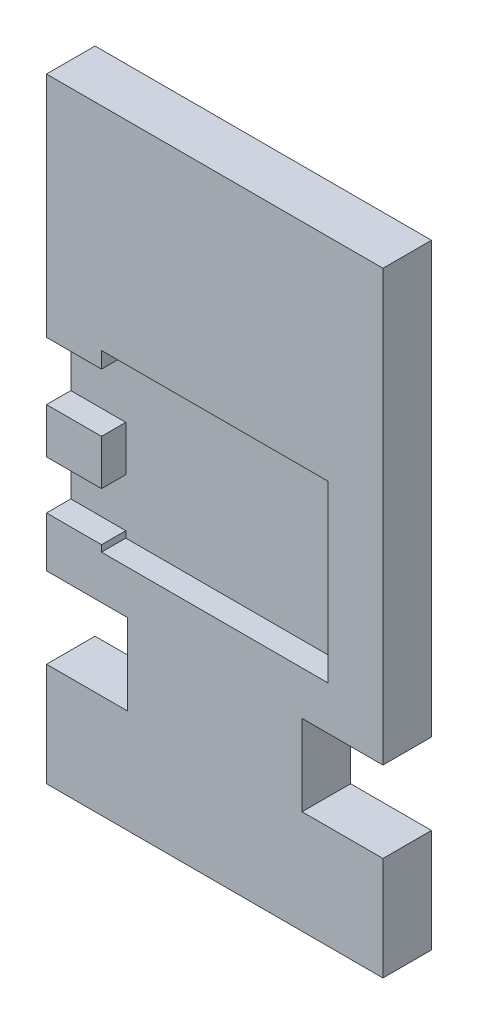
ISO-10303-21;
HEADER;
FILE_DESCRIPTION(('STEP AP214'),'2;1');
FILE_NAME('part.step','',(''),(''),'','','');
FILE_SCHEMA(('AUTOMOTIVE_DESIGN { 1 0 10303 214 1 1 1 1 }'));
ENDSEC;
DATA;
#1=APPLICATION_CONTEXT('core data for automotive mechanical design processes');
#2=APPLICATION_PROTOCOL_DEFINITION('international standard','automotive_design',2000,#1);
#3=PRODUCT_CONTEXT('',#1,'mechanical');
#4=PRODUCT('Part','Part','',(#3));
#5=PRODUCT_RELATED_PRODUCT_CATEGORY('part','',(#4));
#6=PRODUCT_DEFINITION_FORMATION('','',#4);
#7=PRODUCT_DEFINITION_CONTEXT('part definition',#1,'design');
#8=PRODUCT_DEFINITION('design','',#6,#7);
#9=PRODUCT_DEFINITION_SHAPE('','',#8);
#10=(LENGTH_UNIT() NAMED_UNIT(*) SI_UNIT(.MILLI.,.METRE.));
#11=(NAMED_UNIT(*) PLANE_ANGLE_UNIT() SI_UNIT($,.RADIAN.));
#12=(NAMED_UNIT(*) SI_UNIT($,.STERADIAN.) SOLID_ANGLE_UNIT());
#13=UNCERTAINTY_MEASURE_WITH_UNIT(LENGTH_MEASURE(1.E-05),#10,'distance_accuracy_value','');
#14=(GEOMETRIC_REPRESENTATION_CONTEXT(3) GLOBAL_UNCERTAINTY_ASSIGNED_CONTEXT((#13)) GLOBAL_UNIT_ASSIGNED_CONTEXT((#10,
#11,#12)) REPRESENTATION_CONTEXT('',''));
#15=CARTESIAN_POINT('',(0.,0.,0.));
#16=DIRECTION('',(0.,0.,1.));
#17=DIRECTION('',(1.,0.,0.));
#18=AXIS2_PLACEMENT_3D('',#15,#16,#17);
#19=CARTESIAN_POINT('',(0.,0.,0.));
#20=DIRECTION('',(0.,0.,-1.));
#21=DIRECTION('',(-1.,0.,0.));
#22=AXIS2_PLACEMENT_3D('',#19,#20,#21);
#23=PLANE('',#22);
#24=DIRECTION('',(-1.,0.,0.));
#25=VECTOR('',#24,1.);
#26=CARTESIAN_POINT('',(1.02541432135518E-13,133.,0.));
#27=LINE('',#26,#25);
#28=CARTESIAN_POINT('',(70.,133.,0.));
#29=VERTEX_POINT('',#28);
#30=CARTESIAN_POINT('',(34.,133.,0.));
#31=VERTEX_POINT('',#30);
#32=EDGE_CURVE('E11',#29,#31,#27,.T.);
#33=ORIENTED_EDGE('',*,*,#32,.F.);
#34=DIRECTION('',(0.,1.,0.));
#35=VECTOR('',#34,1.);
#36=CARTESIAN_POINT('',(70.,180.,0.));
#37=LINE('',#36,#35);
#38=CARTESIAN_POINT('',(70.,180.,0.));
#39=VERTEX_POINT('',#38);
#40=EDGE_CURVE('E265',#29,#39,#37,.T.);
#41=ORIENTED_EDGE('',*,*,#40,.T.);
#42=DIRECTION('',(1.,0.,0.));
#43=VECTOR('',#42,1.);
#44=CARTESIAN_POINT('',(70.,180.,0.));
#45=LINE('',#44,#43);
#46=CARTESIAN_POINT('',(34.,180.,0.));
#47=VERTEX_POINT('',#46);
#48=EDGE_CURVE('E421',#47,#39,#45,.T.);
#49=ORIENTED_EDGE('',*,*,#48,.F.);
#50=DIRECTION('',(0.,1.,0.));
#51=VECTOR('',#50,1.);
#52=CARTESIAN_POINT('',(34.,180.,0.));
#53=LINE('',#52,#51);
#54=EDGE_CURVE('E408',#31,#47,#53,.T.);
#55=ORIENTED_EDGE('',*,*,#54,.F.);
#56=EDGE_LOOP('',(#33,#41,#49,#55));
#57=FACE_BOUND('',#56,.T.);
#58=DIRECTION('',(0.,1.,0.));
#59=VECTOR('',#58,1.);
#60=CARTESIAN_POINT('',(79.,57.,0.));
#61=LINE('',#60,#59);
#62=CARTESIAN_POINT('',(79.,32.,0.));
#63=VERTEX_POINT('',#62);
#64=CARTESIAN_POINT('',(79.,57.,0.));
#65=VERTEX_POINT('',#64);
#66=EDGE_CURVE('E226',#63,#65,#61,.T.);
#67=ORIENTED_EDGE('',*,*,#66,.F.);
#68=DIRECTION('',(-1.,0.,0.));
#69=VECTOR('',#68,1.);
#70=CARTESIAN_POINT('',(104.,32.,0.));
#71=LINE('',#70,#69);
#72=CARTESIAN_POINT('',(104.,32.,0.));
#73=VERTEX_POINT('',#72);
#74=EDGE_CURVE('E235',#73,#63,#71,.T.);
#75=ORIENTED_EDGE('',*,*,#74,.F.);
#76=DIRECTION('',(0.,-1.,0.));
#77=VECTOR('',#76,1.);
#78=CARTESIAN_POINT('',(104.,0.,0.));
#79=LINE('',#78,#77);
#80=CARTESIAN_POINT('',(104.,0.,0.));
#81=VERTEX_POINT('',#80);
#82=EDGE_CURVE('E298',#73,#81,#79,.T.);
#83=ORIENTED_EDGE('',*,*,#82,.T.);
#84=DIRECTION('',(1.,0.,0.));
#85=VECTOR('',#84,1.);
#86=CARTESIAN_POINT('',(0.,0.,0.));
#87=LINE('',#86,#85);
#88=CARTESIAN_POINT('',(0.,0.,0.));
#89=VERTEX_POINT('',#88);
#90=EDGE_CURVE('E493',#89,#81,#87,.T.);
#91=ORIENTED_EDGE('',*,*,#90,.F.);
#92=DIRECTION('',(0.,-1.,0.));
#93=VECTOR('',#92,1.);
#94=CARTESIAN_POINT('',(0.,0.,0.));
#95=LINE('',#94,#93);
#96=CARTESIAN_POINT('',(0.,32.,0.));
#97=VERTEX_POINT('',#96);
#98=EDGE_CURVE('E471',#97,#89,#95,.T.);
#99=ORIENTED_EDGE('',*,*,#98,.F.);
#100=DIRECTION('',(1.,0.,0.));
#101=VECTOR('',#100,1.);
#102=CARTESIAN_POINT('',(0.,32.,0.));
#103=LINE('',#102,#101);
#104=CARTESIAN_POINT('',(25.,32.,0.));
#105=VERTEX_POINT('',#104);
#106=EDGE_CURVE('E380',#97,#105,#103,.T.);
#107=ORIENTED_EDGE('',*,*,#106,.T.);
#108=DIRECTION('',(0.,1.,0.));
#109=VECTOR('',#108,1.);
#110=CARTESIAN_POINT('',(25.,57.,0.));
#111=LINE('',#110,#109);
#112=CARTESIAN_POINT('',(25.,57.,0.));
#113=VERTEX_POINT('',#112);
#114=EDGE_CURVE('E384',#105,#113,#111,.T.);
#115=ORIENTED_EDGE('',*,*,#114,.T.);
#116=DIRECTION('',(-1.,0.,0.));
#117=VECTOR('',#116,1.);
#118=CARTESIAN_POINT('',(0.,57.,0.));
#119=LINE('',#118,#117);
#120=CARTESIAN_POINT('',(0.,57.,0.));
#121=VERTEX_POINT('',#120);
#122=EDGE_CURVE('E389',#113,#121,#119,.T.);
#123=ORIENTED_EDGE('',*,*,#122,.T.);
#124=CARTESIAN_POINT('',(0.,190.,0.));
#125=VERTEX_POINT('',#124);
#126=EDGE_CURVE('E489',#125,#121,#95,.T.);
#127=ORIENTED_EDGE('',*,*,#126,.F.);
#128=DIRECTION('',(-1.,0.,0.));
#129=VECTOR('',#128,1.);
#130=CARTESIAN_POINT('',(0.,190.,0.));
#131=LINE('',#130,#129);
#132=CARTESIAN_POINT('',(104.,190.,0.));
#133=VERTEX_POINT('',#132);
#134=EDGE_CURVE('E497',#133,#125,#131,.T.);
#135=ORIENTED_EDGE('',*,*,#134,.F.);
#136=CARTESIAN_POINT('',(104.,57.,0.));
#137=VERTEX_POINT('',#136);
#138=EDGE_CURVE('E246',#133,#137,#79,.T.);
#139=ORIENTED_EDGE('',*,*,#138,.T.);
#140=DIRECTION('',(1.,0.,0.));
#141=VECTOR('',#140,1.);
#142=CARTESIAN_POINT('',(104.,57.,0.));
#143=LINE('',#142,#141);
#144=EDGE_CURVE('E55',#65,#137,#143,.T.);
#145=ORIENTED_EDGE('',*,*,#144,.F.);
#146=EDGE_LOOP('',(#67,#75,#83,#91,#99,#107,#115,#123,#127,#135,#139,#145));
#147=FACE_BOUND('',#146,.T.);
#148=ADVANCED_FACE('F39',(#57,#147),#23,.T.);
#149=CARTESIAN_POINT('',(0.,0.,15.));
#150=DIRECTION('',(0.,0.,-1.));
#151=DIRECTION('',(-1.,0.,0.));
#152=AXIS2_PLACEMENT_3D('',#149,#150,#151);
#153=PLANE('',#152);
#154=DIRECTION('',(-1.,0.,0.));
#155=VECTOR('',#154,1.);
#156=CARTESIAN_POINT('',(104.,32.,15.));
#157=LINE('',#156,#155);
#158=CARTESIAN_POINT('',(104.,32.,15.));
#159=VERTEX_POINT('',#158);
#160=CARTESIAN_POINT('',(79.,32.,15.));
#161=VERTEX_POINT('',#160);
#162=EDGE_CURVE('E248',#159,#161,#157,.T.);
#163=ORIENTED_EDGE('',*,*,#162,.T.);
#164=DIRECTION('',(0.,1.,0.));
#165=VECTOR('',#164,1.);
#166=CARTESIAN_POINT('',(79.,57.,15.));
#167=LINE('',#166,#165);
#168=CARTESIAN_POINT('',(79.,57.,15.));
#169=VERTEX_POINT('',#168);
#170=EDGE_CURVE('E252',#161,#169,#167,.T.);
#171=ORIENTED_EDGE('',*,*,#170,.T.);
#172=DIRECTION('',(1.,0.,0.));
#173=VECTOR('',#172,1.);
#174=CARTESIAN_POINT('',(104.,57.,15.));
#175=LINE('',#174,#173);
#176=CARTESIAN_POINT('',(104.,57.,15.));
#177=VERTEX_POINT('',#176);
#178=EDGE_CURVE('E239',#169,#177,#175,.T.);
#179=ORIENTED_EDGE('',*,*,#178,.T.);
#180=DIRECTION('',(0.,-1.,0.));
#181=VECTOR('',#180,1.);
#182=CARTESIAN_POINT('',(104.,0.,15.));
#183=LINE('',#182,#181);
#184=CARTESIAN_POINT('',(104.,190.,15.));
#185=VERTEX_POINT('',#184);
#186=EDGE_CURVE('E302',#185,#177,#183,.T.);
#187=ORIENTED_EDGE('',*,*,#186,.F.);
#188=DIRECTION('',(-1.,0.,0.));
#189=VECTOR('',#188,1.);
#190=CARTESIAN_POINT('',(0.,190.,15.));
#191=LINE('',#190,#189);
#192=CARTESIAN_POINT('',(0.,190.,15.));
#193=VERTEX_POINT('',#192);
#194=EDGE_CURVE('E485',#185,#193,#191,.T.);
#195=ORIENTED_EDGE('',*,*,#194,.T.);
#196=DIRECTION('',(0.,-1.,0.));
#197=VECTOR('',#196,1.);
#198=CARTESIAN_POINT('',(0.,0.,15.));
#199=LINE('',#198,#197);
#200=CARTESIAN_POINT('',(0.,119.5,15.));
#201=VERTEX_POINT('',#200);
#202=EDGE_CURVE('E474',#193,#201,#199,.T.);
#203=ORIENTED_EDGE('',*,*,#202,.T.);
#204=DIRECTION('',(1.,0.,0.));
#205=VECTOR('',#204,1.);
#206=CARTESIAN_POINT('',(-3.00000000000001,119.5,15.));
#207=LINE('',#206,#205);
#208=CARTESIAN_POINT('',(17.,119.5,15.));
#209=VERTEX_POINT('',#208);
#210=EDGE_CURVE('E327',#201,#209,#207,.T.);
#211=ORIENTED_EDGE('',*,*,#210,.T.);
#212=DIRECTION('',(0.,-1.,0.));
#213=VECTOR('',#212,1.);
#214=CARTESIAN_POINT('',(17.,124.5,15.));
#215=LINE('',#214,#213);
#216=CARTESIAN_POINT('',(17.,124.5,15.));
#217=VERTEX_POINT('',#216);
#218=EDGE_CURVE('E460',#217,#209,#215,.T.);
#219=ORIENTED_EDGE('',*,*,#218,.F.);
#220=DIRECTION('',(-1.,0.,0.));
#221=VECTOR('',#220,1.);
#222=CARTESIAN_POINT('',(52.,124.5,15.));
#223=LINE('',#222,#221);
#224=CARTESIAN_POINT('',(87.,124.5,15.));
#225=VERTEX_POINT('',#224);
#226=EDGE_CURVE('E437',#225,#217,#223,.T.);
#227=ORIENTED_EDGE('',*,*,#226,.F.);
#228=DIRECTION('',(0.,-1.,0.));
#229=VECTOR('',#228,1.);
#230=CARTESIAN_POINT('',(87.,124.5,15.));
#231=LINE('',#230,#229);
#232=CARTESIAN_POINT('',(87.,70.5,15.));
#233=VERTEX_POINT('',#232);
#234=EDGE_CURVE('E282',#225,#233,#231,.T.);
#235=ORIENTED_EDGE('',*,*,#234,.T.);
#236=DIRECTION('',(1.,0.,0.));
#237=VECTOR('',#236,1.);
#238=CARTESIAN_POINT('',(52.,70.5,15.));
#239=LINE('',#238,#237);
#240=CARTESIAN_POINT('',(17.,70.5,15.));
#241=VERTEX_POINT('',#240);
#242=EDGE_CURVE('E446',#241,#233,#239,.T.);
#243=ORIENTED_EDGE('',*,*,#242,.F.);
#244=CARTESIAN_POINT('',(17.,72.5,15.));
#245=VERTEX_POINT('',#244);
#246=EDGE_CURVE('E459',#245,#241,#215,.T.);
#247=ORIENTED_EDGE('',*,*,#246,.F.);
#248=DIRECTION('',(1.,0.,0.));
#249=VECTOR('',#248,1.);
#250=CARTESIAN_POINT('',(-3.,72.5,15.));
#251=LINE('',#250,#249);
#252=CARTESIAN_POINT('',(0.,72.5,15.));
#253=VERTEX_POINT('',#252);
#254=EDGE_CURVE('E352',#253,#245,#251,.T.);
#255=ORIENTED_EDGE('',*,*,#254,.F.);
#256=CARTESIAN_POINT('',(0.,57.,15.));
#257=VERTEX_POINT('',#256);
#258=EDGE_CURVE('E480',#253,#257,#199,.T.);
#259=ORIENTED_EDGE('',*,*,#258,.T.);
#260=DIRECTION('',(-1.,0.,0.));
#261=VECTOR('',#260,1.);
#262=CARTESIAN_POINT('',(0.,57.,15.));
#263=LINE('',#262,#261);
#264=CARTESIAN_POINT('',(25.,57.,15.));
#265=VERTEX_POINT('',#264);
#266=EDGE_CURVE('E385',#265,#257,#263,.T.);
#267=ORIENTED_EDGE('',*,*,#266,.F.);
#268=DIRECTION('',(0.,1.,0.));
#269=VECTOR('',#268,1.);
#270=CARTESIAN_POINT('',(25.,57.,15.));
#271=LINE('',#270,#269);
#272=CARTESIAN_POINT('',(25.,32.,15.));
#273=VERTEX_POINT('',#272);
#274=EDGE_CURVE('E397',#273,#265,#271,.T.);
#275=ORIENTED_EDGE('',*,*,#274,.F.);
#276=DIRECTION('',(1.,0.,0.));
#277=VECTOR('',#276,1.);
#278=CARTESIAN_POINT('',(0.,32.,15.));
#279=LINE('',#278,#277);
#280=CARTESIAN_POINT('',(0.,32.,15.));
#281=VERTEX_POINT('',#280);
#282=EDGE_CURVE('E379',#281,#273,#279,.T.);
#283=ORIENTED_EDGE('',*,*,#282,.F.);
#284=CARTESIAN_POINT('',(0.,0.,15.));
#285=VERTEX_POINT('',#284);
#286=EDGE_CURVE('E481',#281,#285,#199,.T.);
#287=ORIENTED_EDGE('',*,*,#286,.T.);
#288=DIRECTION('',(1.,0.,0.));
#289=VECTOR('',#288,1.);
#290=CARTESIAN_POINT('',(0.,0.,15.));
#291=LINE('',#290,#289);
#292=CARTESIAN_POINT('',(104.,0.,15.));
#293=VERTEX_POINT('',#292);
#294=EDGE_CURVE('E478',#285,#293,#291,.T.);
#295=ORIENTED_EDGE('',*,*,#294,.T.);
#296=EDGE_CURVE('E307',#159,#293,#183,.T.);
#297=ORIENTED_EDGE('',*,*,#296,.F.);
#298=EDGE_LOOP('',(#163,#171,#179,#187,#195,#203,#211,#219,#227,#235,#243,#247,#255,#259,#267,
#275,#283,#287,#295,#297));
#299=FACE_BOUND('',#298,.T.);
#300=ADVANCED_FACE('F566',(#299),#153,.F.);
#301=CARTESIAN_POINT('',(104.,0.,15.));
#302=DIRECTION('',(1.,0.,0.));
#303=DIRECTION('',(0.,0.,-1.));
#304=AXIS2_PLACEMENT_3D('',#301,#302,#303);
#305=PLANE('',#304);
#306=ORIENTED_EDGE('',*,*,#82,.F.);
#307=DIRECTION('',(0.,0.,1.));
#308=VECTOR('',#307,1.);
#309=CARTESIAN_POINT('',(104.,32.,0.));
#310=LINE('',#309,#308);
#311=EDGE_CURVE('E261',#73,#159,#310,.T.);
#312=ORIENTED_EDGE('',*,*,#311,.T.);
#313=ORIENTED_EDGE('',*,*,#296,.T.);
#314=DIRECTION('',(0.,0.,-1.));
#315=VECTOR('',#314,1.);
#316=CARTESIAN_POINT('',(104.,0.,15.));
#317=LINE('',#316,#315);
#318=EDGE_CURVE('E306',#293,#81,#317,.T.);
#319=ORIENTED_EDGE('',*,*,#318,.T.);
#320=EDGE_LOOP('',(#306,#312,#313,#319));
#321=FACE_BOUND('',#320,.T.);
#322=ADVANCED_FACE('F572',(#321),#305,.T.);
#323=ORIENTED_EDGE('',*,*,#186,.T.);
#324=DIRECTION('',(0.,0.,1.));
#325=VECTOR('',#324,1.);
#326=CARTESIAN_POINT('',(104.,57.,0.));
#327=LINE('',#326,#325);
#328=EDGE_CURVE('E242',#137,#177,#327,.T.);
#329=ORIENTED_EDGE('',*,*,#328,.F.);
#330=ORIENTED_EDGE('',*,*,#138,.F.);
#331=DIRECTION('',(0.,0.,-1.));
#332=VECTOR('',#331,1.);
#333=CARTESIAN_POINT('',(104.,190.,15.));
#334=LINE('',#333,#332);
#335=EDGE_CURVE('E313',#185,#133,#334,.T.);
#336=ORIENTED_EDGE('',*,*,#335,.F.);
#337=EDGE_LOOP('',(#323,#329,#330,#336));
#338=FACE_BOUND('',#337,.T.);
#339=ADVANCED_FACE('F592',(#338),#305,.T.);
#340=CARTESIAN_POINT('',(0.,0.,15.));
#341=DIRECTION('',(1.,0.,0.));
#342=DIRECTION('',(0.,0.,-1.));
#343=AXIS2_PLACEMENT_3D('',#340,#341,#342);
#344=PLANE('',#343);
#345=DIRECTION('',(0.,0.,-1.));
#346=VECTOR('',#345,1.);
#347=CARTESIAN_POINT('',(0.,119.5,15.));
#348=LINE('',#347,#346);
#349=CARTESIAN_POINT('',(0.,119.5,7.5));
#350=VERTEX_POINT('',#349);
#351=EDGE_CURVE('E376',#201,#350,#348,.T.);
#352=ORIENTED_EDGE('',*,*,#351,.F.);
#353=ORIENTED_EDGE('',*,*,#202,.F.);
#354=DIRECTION('',(0.,0.,-1.));
#355=VECTOR('',#354,1.);
#356=CARTESIAN_POINT('',(0.,190.,15.));
#357=LINE('',#356,#355);
#358=EDGE_CURVE('E488',#193,#125,#357,.T.);
#359=ORIENTED_EDGE('',*,*,#358,.T.);
#360=ORIENTED_EDGE('',*,*,#126,.T.);
#361=DIRECTION('',(0.,0.,1.));
#362=VECTOR('',#361,1.);
#363=CARTESIAN_POINT('',(0.,57.,0.));
#364=LINE('',#363,#362);
#365=EDGE_CURVE('E404',#121,#257,#364,.T.);
#366=ORIENTED_EDGE('',*,*,#365,.T.);
#367=ORIENTED_EDGE('',*,*,#258,.F.);
#368=DIRECTION('',(0.,0.,-1.));
#369=VECTOR('',#368,1.);
#370=CARTESIAN_POINT('',(0.,72.5,15.));
#371=LINE('',#370,#369);
#372=CARTESIAN_POINT('',(0.,72.5,7.5));
#373=VERTEX_POINT('',#372);
#374=EDGE_CURVE('E331',#253,#373,#371,.T.);
#375=ORIENTED_EDGE('',*,*,#374,.T.);
#376=DIRECTION('',(0.,1.,0.));
#377=VECTOR('',#376,1.);
#378=CARTESIAN_POINT('',(0.,0.,7.5));
#379=LINE('',#378,#377);
#380=CARTESIAN_POINT('',(0.,87.5,7.5));
#381=VERTEX_POINT('',#380);
#382=EDGE_CURVE('E361',#373,#381,#379,.T.);
#383=ORIENTED_EDGE('',*,*,#382,.T.);
#384=DIRECTION('',(0.,0.,-1.));
#385=VECTOR('',#384,1.);
#386=CARTESIAN_POINT('',(0.,87.5,15.));
#387=LINE('',#386,#385);
#388=CARTESIAN_POINT('',(0.,87.5,15.));
#389=VERTEX_POINT('',#388);
#390=EDGE_CURVE('E365',#389,#381,#387,.T.);
#391=ORIENTED_EDGE('',*,*,#390,.F.);
#392=CARTESIAN_POINT('',(0.,101.5,15.));
#393=VERTEX_POINT('',#392);
#394=EDGE_CURVE('E479',#393,#389,#199,.T.);
#395=ORIENTED_EDGE('',*,*,#394,.F.);
#396=DIRECTION('',(0.,0.,-1.));
#397=VECTOR('',#396,1.);
#398=CARTESIAN_POINT('',(0.,101.5,15.));
#399=LINE('',#398,#397);
#400=CARTESIAN_POINT('',(0.,101.5,7.5));
#401=VERTEX_POINT('',#400);
#402=EDGE_CURVE('E368',#393,#401,#399,.T.);
#403=ORIENTED_EDGE('',*,*,#402,.T.);
#404=DIRECTION('',(0.,1.,0.));
#405=VECTOR('',#404,1.);
#406=CARTESIAN_POINT('',(0.,0.,7.5));
#407=LINE('',#406,#405);
#408=EDGE_CURVE('E372',#401,#350,#407,.T.);
#409=ORIENTED_EDGE('',*,*,#408,.T.);
#410=EDGE_LOOP('',(#352,#353,#359,#360,#366,#367,#375,#383,#391,#395,#403,#409));
#411=FACE_BOUND('',#410,.T.);
#412=ADVANCED_FACE('F537',(#411),#344,.F.);
#413=CARTESIAN_POINT('',(17.,101.5,15.));
#414=VERTEX_POINT('',#413);
#415=CARTESIAN_POINT('',(17.,87.5,15.));
#416=VERTEX_POINT('',#415);
#417=EDGE_CURVE('E464',#414,#416,#215,.T.);
#418=ORIENTED_EDGE('',*,*,#417,.F.);
#419=DIRECTION('',(1.,0.,0.));
#420=VECTOR('',#419,1.);
#421=CARTESIAN_POINT('',(-3.00000000000001,101.5,15.));
#422=LINE('',#421,#420);
#423=EDGE_CURVE('E326',#393,#414,#422,.T.);
#424=ORIENTED_EDGE('',*,*,#423,.F.);
#425=ORIENTED_EDGE('',*,*,#394,.T.);
#426=DIRECTION('',(1.,0.,0.));
#427=VECTOR('',#426,1.);
#428=CARTESIAN_POINT('',(-3.,87.5,15.));
#429=LINE('',#428,#427);
#430=EDGE_CURVE('E346',#389,#416,#429,.T.);
#431=ORIENTED_EDGE('',*,*,#430,.T.);
#432=EDGE_LOOP('',(#418,#424,#425,#431));
#433=FACE_BOUND('',#432,.T.);
#434=ADVANCED_FACE('F533',(#433),#153,.F.);
#435=CARTESIAN_POINT('',(17.,124.5,7.5));
#436=DIRECTION('',(-1.,0.,0.));
#437=DIRECTION('',(0.,-1.,0.));
#438=AXIS2_PLACEMENT_3D('',#435,#436,#437);
#439=PLANE('',#438);
#440=DIRECTION('',(0.,0.,-1.));
#441=VECTOR('',#440,1.);
#442=CARTESIAN_POINT('',(17.,119.5,0.));
#443=LINE('',#442,#441);
#444=CARTESIAN_POINT('',(17.,119.5,7.5));
#445=VERTEX_POINT('',#444);
#446=EDGE_CURVE('E321',#209,#445,#443,.T.);
#447=ORIENTED_EDGE('',*,*,#446,.T.);
#448=DIRECTION('',(0.,-1.,0.));
#449=VECTOR('',#448,1.);
#450=CARTESIAN_POINT('',(17.,124.5,7.5));
#451=LINE('',#450,#449);
#452=CARTESIAN_POINT('',(17.,124.5,7.5));
#453=VERTEX_POINT('',#452);
#454=EDGE_CURVE('E447',#453,#445,#451,.T.);
#455=ORIENTED_EDGE('',*,*,#454,.F.);
#456=DIRECTION('',(0.,0.,1.));
#457=VECTOR('',#456,1.);
#458=CARTESIAN_POINT('',(17.,124.5,7.5));
#459=LINE('',#458,#457);
#460=EDGE_CURVE('E455',#453,#217,#459,.T.);
#461=ORIENTED_EDGE('',*,*,#460,.T.);
#462=ORIENTED_EDGE('',*,*,#218,.T.);
#463=EDGE_LOOP('',(#447,#455,#461,#462));
#464=FACE_BOUND('',#463,.T.);
#465=ADVANCED_FACE('F588',(#464),#439,.F.);
#466=CARTESIAN_POINT('',(17.,101.5,7.5));
#467=VERTEX_POINT('',#466);
#468=CARTESIAN_POINT('',(17.,87.5,7.5));
#469=VERTEX_POINT('',#468);
#470=EDGE_CURVE('E452',#467,#469,#451,.T.);
#471=ORIENTED_EDGE('',*,*,#470,.F.);
#472=DIRECTION('',(0.,0.,-1.));
#473=VECTOR('',#472,1.);
#474=CARTESIAN_POINT('',(17.,101.5,0.));
#475=LINE('',#474,#473);
#476=EDGE_CURVE('E318',#414,#467,#475,.T.);
#477=ORIENTED_EDGE('',*,*,#476,.F.);
#478=ORIENTED_EDGE('',*,*,#417,.T.);
#479=DIRECTION('',(0.,0.,-1.));
#480=VECTOR('',#479,1.);
#481=CARTESIAN_POINT('',(17.,87.5,0.));
#482=LINE('',#481,#480);
#483=EDGE_CURVE('E317',#416,#469,#482,.T.);
#484=ORIENTED_EDGE('',*,*,#483,.T.);
#485=EDGE_LOOP('',(#471,#477,#478,#484));
#486=FACE_BOUND('',#485,.T.);
#487=ADVANCED_FACE('F547',(#486),#439,.F.);
#488=ORIENTED_EDGE('',*,*,#286,.F.);
#489=DIRECTION('',(0.,0.,1.));
#490=VECTOR('',#489,1.);
#491=CARTESIAN_POINT('',(0.,32.,0.));
#492=LINE('',#491,#490);
#493=EDGE_CURVE('E393',#97,#281,#492,.T.);
#494=ORIENTED_EDGE('',*,*,#493,.F.);
#495=ORIENTED_EDGE('',*,*,#98,.T.);
#496=DIRECTION('',(0.,0.,-1.));
#497=VECTOR('',#496,1.);
#498=CARTESIAN_POINT('',(0.,0.,15.));
#499=LINE('',#498,#497);
#500=EDGE_CURVE('E48',#285,#89,#499,.T.);
#501=ORIENTED_EDGE('',*,*,#500,.F.);
#502=EDGE_LOOP('',(#488,#494,#495,#501));
#503=FACE_BOUND('',#502,.T.);
#504=ADVANCED_FACE('F41',(#503),#344,.F.);
#505=CARTESIAN_POINT('',(0.,0.,15.));
#506=DIRECTION('',(0.,1.,0.));
#507=DIRECTION('',(0.,0.,1.));
#508=AXIS2_PLACEMENT_3D('',#505,#506,#507);
#509=PLANE('',#508);
#510=ORIENTED_EDGE('',*,*,#90,.T.);
#511=ORIENTED_EDGE('',*,*,#318,.F.);
#512=ORIENTED_EDGE('',*,*,#294,.F.);
#513=ORIENTED_EDGE('',*,*,#500,.T.);
#514=EDGE_LOOP('',(#510,#511,#512,#513));
#515=FACE_BOUND('',#514,.T.);
#516=ADVANCED_FACE('F507',(#515),#509,.F.);
#517=CARTESIAN_POINT('',(0.,190.,15.));
#518=DIRECTION('',(0.,-1.,0.));
#519=DIRECTION('',(0.,0.,-1.));
#520=AXIS2_PLACEMENT_3D('',#517,#518,#519);
#521=PLANE('',#520);
#522=ORIENTED_EDGE('',*,*,#134,.T.);
#523=ORIENTED_EDGE('',*,*,#358,.F.);
#524=ORIENTED_EDGE('',*,*,#194,.F.);
#525=ORIENTED_EDGE('',*,*,#335,.T.);
#526=EDGE_LOOP('',(#522,#523,#524,#525));
#527=FACE_BOUND('',#526,.T.);
#528=ADVANCED_FACE('F577',(#527),#521,.F.);
#529=CARTESIAN_POINT('',(52.,70.5,7.5));
#530=DIRECTION('',(0.,-1.,0.));
#531=DIRECTION('',(0.,0.,-1.));
#532=AXIS2_PLACEMENT_3D('',#529,#530,#531);
#533=PLANE('',#532);
#534=ORIENTED_EDGE('',*,*,#242,.T.);
#535=DIRECTION('',(0.,0.,1.));
#536=VECTOR('',#535,1.);
#537=CARTESIAN_POINT('',(87.,70.5,7.5));
#538=LINE('',#537,#536);
#539=CARTESIAN_POINT('',(87.,70.5,7.5));
#540=VERTEX_POINT('',#539);
#541=EDGE_CURVE('E290',#540,#233,#538,.T.);
#542=ORIENTED_EDGE('',*,*,#541,.F.);
#543=DIRECTION('',(1.,0.,0.));
#544=VECTOR('',#543,1.);
#545=CARTESIAN_POINT('',(52.,70.5,7.5));
#546=LINE('',#545,#544);
#547=CARTESIAN_POINT('',(17.,70.5,7.5));
#548=VERTEX_POINT('',#547);
#549=EDGE_CURVE('E451',#548,#540,#546,.T.);
#550=ORIENTED_EDGE('',*,*,#549,.F.);
#551=DIRECTION('',(0.,0.,1.));
#552=VECTOR('',#551,1.);
#553=CARTESIAN_POINT('',(17.,70.5,7.5));
#554=LINE('',#553,#552);
#555=EDGE_CURVE('E467',#548,#241,#554,.T.);
#556=ORIENTED_EDGE('',*,*,#555,.T.);
#557=EDGE_LOOP('',(#534,#542,#550,#556));
#558=FACE_BOUND('',#557,.T.);
#559=ADVANCED_FACE('F579',(#558),#533,.F.);
#560=CARTESIAN_POINT('',(17.,72.5,7.5));
#561=VERTEX_POINT('',#560);
#562=EDGE_CURVE('E445',#561,#548,#451,.T.);
#563=ORIENTED_EDGE('',*,*,#562,.F.);
#564=DIRECTION('',(0.,0.,-1.));
#565=VECTOR('',#564,1.);
#566=CARTESIAN_POINT('',(17.,72.5,0.));
#567=LINE('',#566,#565);
#568=EDGE_CURVE('E63',#245,#561,#567,.T.);
#569=ORIENTED_EDGE('',*,*,#568,.F.);
#570=ORIENTED_EDGE('',*,*,#246,.T.);
#571=ORIENTED_EDGE('',*,*,#555,.F.);
#572=EDGE_LOOP('',(#563,#569,#570,#571));
#573=FACE_BOUND('',#572,.T.);
#574=ADVANCED_FACE('F590',(#573),#439,.F.);
#575=CARTESIAN_POINT('',(52.,124.5,7.5));
#576=DIRECTION('',(0.,1.,0.));
#577=DIRECTION('',(0.,0.,1.));
#578=AXIS2_PLACEMENT_3D('',#575,#576,#577);
#579=PLANE('',#578);
#580=ORIENTED_EDGE('',*,*,#226,.T.);
#581=ORIENTED_EDGE('',*,*,#460,.F.);
#582=DIRECTION('',(-1.,0.,0.));
#583=VECTOR('',#582,1.);
#584=CARTESIAN_POINT('',(52.,124.5,7.5));
#585=LINE('',#584,#583);
#586=CARTESIAN_POINT('',(87.,124.5,7.5));
#587=VERTEX_POINT('',#586);
#588=EDGE_CURVE('E441',#587,#453,#585,.T.);
#589=ORIENTED_EDGE('',*,*,#588,.F.);
#590=DIRECTION('',(0.,0.,1.));
#591=VECTOR('',#590,1.);
#592=CARTESIAN_POINT('',(87.,124.5,7.5));
#593=LINE('',#592,#591);
#594=EDGE_CURVE('E294',#587,#225,#593,.T.);
#595=ORIENTED_EDGE('',*,*,#594,.T.);
#596=EDGE_LOOP('',(#580,#581,#589,#595));
#597=FACE_BOUND('',#596,.T.);
#598=ADVANCED_FACE('F642',(#597),#579,.F.);
#599=CARTESIAN_POINT('',(0.,0.,7.5));
#600=DIRECTION('',(0.,0.,-1.));
#601=DIRECTION('',(-1.,0.,0.));
#602=AXIS2_PLACEMENT_3D('',#599,#600,#601);
#603=PLANE('',#602);
#604=ORIENTED_EDGE('',*,*,#549,.T.);
#605=DIRECTION('',(0.,-1.,0.));
#606=VECTOR('',#605,1.);
#607=CARTESIAN_POINT('',(87.,124.5,7.5));
#608=LINE('',#607,#606);
#609=EDGE_CURVE('E286',#587,#540,#608,.T.);
#610=ORIENTED_EDGE('',*,*,#609,.F.);
#611=ORIENTED_EDGE('',*,*,#588,.T.);
#612=ORIENTED_EDGE('',*,*,#454,.T.);
#613=DIRECTION('',(1.,0.,0.));
#614=VECTOR('',#613,1.);
#615=CARTESIAN_POINT('',(-3.00000000000001,119.5,7.5));
#616=LINE('',#615,#614);
#617=EDGE_CURVE('E332',#350,#445,#616,.T.);
#618=ORIENTED_EDGE('',*,*,#617,.F.);
#619=ORIENTED_EDGE('',*,*,#408,.F.);
#620=DIRECTION('',(1.,0.,0.));
#621=VECTOR('',#620,1.);
#622=CARTESIAN_POINT('',(-3.00000000000001,101.5,7.5));
#623=LINE('',#622,#621);
#624=EDGE_CURVE('E335',#401,#467,#623,.T.);
#625=ORIENTED_EDGE('',*,*,#624,.T.);
#626=ORIENTED_EDGE('',*,*,#470,.T.);
#627=DIRECTION('',(1.,0.,0.));
#628=VECTOR('',#627,1.);
#629=CARTESIAN_POINT('',(-3.,87.5,7.5));
#630=LINE('',#629,#628);
#631=EDGE_CURVE('E322',#381,#469,#630,.T.);
#632=ORIENTED_EDGE('',*,*,#631,.F.);
#633=ORIENTED_EDGE('',*,*,#382,.F.);
#634=DIRECTION('',(1.,0.,0.));
#635=VECTOR('',#634,1.);
#636=CARTESIAN_POINT('',(-3.,72.5,7.5));
#637=LINE('',#636,#635);
#638=EDGE_CURVE('E349',#373,#561,#637,.T.);
#639=ORIENTED_EDGE('',*,*,#638,.T.);
#640=ORIENTED_EDGE('',*,*,#562,.T.);
#641=EDGE_LOOP('',(#604,#610,#611,#612,#618,#619,#625,#626,#632,#633,#639,#640));
#642=FACE_BOUND('',#641,.T.);
#643=ADVANCED_FACE('F542',(#642),#603,.F.);
#644=CARTESIAN_POINT('',(0.,0.,5.));
#645=DIRECTION('',(0.,0.,-1.));
#646=DIRECTION('',(-1.,0.,0.));
#647=AXIS2_PLACEMENT_3D('',#644,#645,#646);
#648=PLANE('',#647);
#649=DIRECTION('',(1.,0.,0.));
#650=VECTOR('',#649,1.);
#651=CARTESIAN_POINT('',(70.,180.,5.));
#652=LINE('',#651,#650);
#653=CARTESIAN_POINT('',(34.,180.,5.));
#654=VERTEX_POINT('',#653);
#655=CARTESIAN_POINT('',(70.,180.,5.));
#656=VERTEX_POINT('',#655);
#657=EDGE_CURVE('E425',#654,#656,#652,.T.);
#658=ORIENTED_EDGE('',*,*,#657,.T.);
#659=DIRECTION('',(0.,1.,0.));
#660=VECTOR('',#659,1.);
#661=CARTESIAN_POINT('',(70.,180.,5.));
#662=LINE('',#661,#660);
#663=CARTESIAN_POINT('',(70.,133.,5.));
#664=VERTEX_POINT('',#663);
#665=EDGE_CURVE('E270',#664,#656,#662,.T.);
#666=ORIENTED_EDGE('',*,*,#665,.F.);
#667=DIRECTION('',(-1.,0.,0.));
#668=VECTOR('',#667,1.);
#669=CARTESIAN_POINT('',(70.,133.,5.));
#670=LINE('',#669,#668);
#671=CARTESIAN_POINT('',(34.,133.,5.));
#672=VERTEX_POINT('',#671);
#673=EDGE_CURVE('E417',#664,#672,#670,.T.);
#674=ORIENTED_EDGE('',*,*,#673,.T.);
#675=DIRECTION('',(0.,1.,0.));
#676=VECTOR('',#675,1.);
#677=CARTESIAN_POINT('',(34.,180.,5.));
#678=LINE('',#677,#676);
#679=EDGE_CURVE('E420',#672,#654,#678,.T.);
#680=ORIENTED_EDGE('',*,*,#679,.T.);
#681=EDGE_LOOP('',(#658,#666,#674,#680));
#682=FACE_BOUND('',#681,.T.);
#683=ADVANCED_FACE('F664',(#682),#648,.T.);
#684=CARTESIAN_POINT('',(70.,180.,5.));
#685=DIRECTION('',(0.,1.,0.));
#686=DIRECTION('',(0.,0.,1.));
#687=AXIS2_PLACEMENT_3D('',#684,#685,#686);
#688=PLANE('',#687);
#689=ORIENTED_EDGE('',*,*,#657,.F.);
#690=DIRECTION('',(0.,0.,-1.));
#691=VECTOR('',#690,1.);
#692=CARTESIAN_POINT('',(34.,180.,5.));
#693=LINE('',#692,#691);
#694=EDGE_CURVE('E434',#654,#47,#693,.T.);
#695=ORIENTED_EDGE('',*,*,#694,.T.);
#696=ORIENTED_EDGE('',*,*,#48,.T.);
#697=DIRECTION('',(0.,0.,-1.));
#698=VECTOR('',#697,1.);
#699=CARTESIAN_POINT('',(70.,180.,5.));
#700=LINE('',#699,#698);
#701=EDGE_CURVE('E274',#656,#39,#700,.T.);
#702=ORIENTED_EDGE('',*,*,#701,.F.);
#703=EDGE_LOOP('',(#689,#695,#696,#702));
#704=FACE_BOUND('',#703,.T.);
#705=ADVANCED_FACE('F667',(#704),#688,.F.);
#706=CARTESIAN_POINT('',(70.,133.,5.));
#707=DIRECTION('',(0.,-1.,0.));
#708=DIRECTION('',(1.,0.,0.));
#709=AXIS2_PLACEMENT_3D('',#706,#707,#708);
#710=PLANE('',#709);
#711=ORIENTED_EDGE('',*,*,#32,.T.);
#712=DIRECTION('',(0.,0.,-1.));
#713=VECTOR('',#712,1.);
#714=CARTESIAN_POINT('',(34.,133.,5.));
#715=LINE('',#714,#713);
#716=EDGE_CURVE('E428',#672,#31,#715,.T.);
#717=ORIENTED_EDGE('',*,*,#716,.F.);
#718=ORIENTED_EDGE('',*,*,#673,.F.);
#719=DIRECTION('',(0.,0.,-1.));
#720=VECTOR('',#719,1.);
#721=CARTESIAN_POINT('',(70.,133.,5.));
#722=LINE('',#721,#720);
#723=EDGE_CURVE('E278',#664,#29,#722,.T.);
#724=ORIENTED_EDGE('',*,*,#723,.T.);
#725=EDGE_LOOP('',(#711,#717,#718,#724));
#726=FACE_BOUND('',#725,.T.);
#727=ADVANCED_FACE('F671',(#726),#710,.F.);
#728=CARTESIAN_POINT('',(34.,180.,5.));
#729=DIRECTION('',(-1.,0.,0.));
#730=DIRECTION('',(0.,-1.,0.));
#731=AXIS2_PLACEMENT_3D('',#728,#729,#730);
#732=PLANE('',#731);
#733=ORIENTED_EDGE('',*,*,#54,.T.);
#734=ORIENTED_EDGE('',*,*,#694,.F.);
#735=ORIENTED_EDGE('',*,*,#679,.F.);
#736=ORIENTED_EDGE('',*,*,#716,.T.);
#737=EDGE_LOOP('',(#733,#734,#735,#736));
#738=FACE_BOUND('',#737,.T.);
#739=ADVANCED_FACE('F659',(#738),#732,.F.);
#740=CARTESIAN_POINT('',(0.,57.,0.));
#741=DIRECTION('',(0.,1.,0.));
#742=DIRECTION('',(0.,0.,1.));
#743=AXIS2_PLACEMENT_3D('',#740,#741,#742);
#744=PLANE('',#743);
#745=ORIENTED_EDGE('',*,*,#266,.T.);
#746=ORIENTED_EDGE('',*,*,#365,.F.);
#747=ORIENTED_EDGE('',*,*,#122,.F.);
#748=DIRECTION('',(0.,0.,1.));
#749=VECTOR('',#748,1.);
#750=CARTESIAN_POINT('',(25.,57.,0.));
#751=LINE('',#750,#749);
#752=EDGE_CURVE('E409',#113,#265,#751,.T.);
#753=ORIENTED_EDGE('',*,*,#752,.T.);
#754=EDGE_LOOP('',(#745,#746,#747,#753));
#755=FACE_BOUND('',#754,.T.);
#756=ADVANCED_FACE('F627',(#755),#744,.F.);
#757=CARTESIAN_POINT('',(25.,57.,0.));
#758=DIRECTION('',(1.,0.,0.));
#759=DIRECTION('',(0.,0.,-1.));
#760=AXIS2_PLACEMENT_3D('',#757,#758,#759);
#761=PLANE('',#760);
#762=ORIENTED_EDGE('',*,*,#274,.T.);
#763=ORIENTED_EDGE('',*,*,#752,.F.);
#764=ORIENTED_EDGE('',*,*,#114,.F.);
#765=DIRECTION('',(0.,0.,1.));
#766=VECTOR('',#765,1.);
#767=CARTESIAN_POINT('',(25.,32.,0.));
#768=LINE('',#767,#766);
#769=EDGE_CURVE('E412',#105,#273,#768,.T.);
#770=ORIENTED_EDGE('',*,*,#769,.T.);
#771=EDGE_LOOP('',(#762,#763,#764,#770));
#772=FACE_BOUND('',#771,.T.);
#773=ADVANCED_FACE('F625',(#772),#761,.F.);
#774=CARTESIAN_POINT('',(0.,32.,0.));
#775=DIRECTION('',(0.,-1.,0.));
#776=DIRECTION('',(0.,0.,-1.));
#777=AXIS2_PLACEMENT_3D('',#774,#775,#776);
#778=PLANE('',#777);
#779=ORIENTED_EDGE('',*,*,#282,.T.);
#780=ORIENTED_EDGE('',*,*,#769,.F.);
#781=ORIENTED_EDGE('',*,*,#106,.F.);
#782=ORIENTED_EDGE('',*,*,#493,.T.);
#783=EDGE_LOOP('',(#779,#780,#781,#782));
#784=FACE_BOUND('',#783,.T.);
#785=ADVANCED_FACE('F621',(#784),#778,.F.);
#786=CARTESIAN_POINT('',(-3.,87.5,0.));
#787=DIRECTION('',(0.,-1.,0.));
#788=DIRECTION('',(1.,0.,0.));
#789=AXIS2_PLACEMENT_3D('',#786,#787,#788);
#790=PLANE('',#789);
#791=ORIENTED_EDGE('',*,*,#390,.T.);
#792=ORIENTED_EDGE('',*,*,#631,.T.);
#793=ORIENTED_EDGE('',*,*,#483,.F.);
#794=ORIENTED_EDGE('',*,*,#430,.F.);
#795=EDGE_LOOP('',(#791,#792,#793,#794));
#796=FACE_BOUND('',#795,.T.);
#797=ADVANCED_FACE('F540',(#796),#790,.T.);
#798=CARTESIAN_POINT('',(-3.,72.5,0.));
#799=DIRECTION('',(0.,-1.,0.));
#800=DIRECTION('',(1.,0.,0.));
#801=AXIS2_PLACEMENT_3D('',#798,#799,#800);
#802=PLANE('',#801);
#803=ORIENTED_EDGE('',*,*,#254,.T.);
#804=ORIENTED_EDGE('',*,*,#568,.T.);
#805=ORIENTED_EDGE('',*,*,#638,.F.);
#806=ORIENTED_EDGE('',*,*,#374,.F.);
#807=EDGE_LOOP('',(#803,#804,#805,#806));
#808=FACE_BOUND('',#807,.T.);
#809=ADVANCED_FACE('F561',(#808),#802,.F.);
#810=CARTESIAN_POINT('',(-3.00000000000001,119.5,0.));
#811=DIRECTION('',(0.,-1.,0.));
#812=DIRECTION('',(1.,0.,0.));
#813=AXIS2_PLACEMENT_3D('',#810,#811,#812);
#814=PLANE('',#813);
#815=ORIENTED_EDGE('',*,*,#351,.T.);
#816=ORIENTED_EDGE('',*,*,#617,.T.);
#817=ORIENTED_EDGE('',*,*,#446,.F.);
#818=ORIENTED_EDGE('',*,*,#210,.F.);
#819=EDGE_LOOP('',(#815,#816,#817,#818));
#820=FACE_BOUND('',#819,.T.);
#821=ADVANCED_FACE('F552',(#820),#814,.T.);
#822=CARTESIAN_POINT('',(-3.00000000000001,101.5,0.));
#823=DIRECTION('',(0.,-1.,0.));
#824=DIRECTION('',(1.,0.,0.));
#825=AXIS2_PLACEMENT_3D('',#822,#823,#824);
#826=PLANE('',#825);
#827=ORIENTED_EDGE('',*,*,#423,.T.);
#828=ORIENTED_EDGE('',*,*,#476,.T.);
#829=ORIENTED_EDGE('',*,*,#624,.F.);
#830=ORIENTED_EDGE('',*,*,#402,.F.);
#831=EDGE_LOOP('',(#827,#828,#829,#830));
#832=FACE_BOUND('',#831,.T.);
#833=ADVANCED_FACE('F549',(#832),#826,.F.);
#834=CARTESIAN_POINT('',(87.,124.5,7.5));
#835=DIRECTION('',(-1.,0.,0.));
#836=DIRECTION('',(0.,-1.,0.));
#837=AXIS2_PLACEMENT_3D('',#834,#835,#836);
#838=PLANE('',#837);
#839=ORIENTED_EDGE('',*,*,#234,.F.);
#840=ORIENTED_EDGE('',*,*,#594,.F.);
#841=ORIENTED_EDGE('',*,*,#609,.T.);
#842=ORIENTED_EDGE('',*,*,#541,.T.);
#843=EDGE_LOOP('',(#839,#840,#841,#842));
#844=FACE_BOUND('',#843,.T.);
#845=ADVANCED_FACE('F551',(#844),#838,.T.);
#846=CARTESIAN_POINT('',(70.,180.,5.));
#847=DIRECTION('',(-1.,0.,0.));
#848=DIRECTION('',(0.,-1.,0.));
#849=AXIS2_PLACEMENT_3D('',#846,#847,#848);
#850=PLANE('',#849);
#851=ORIENTED_EDGE('',*,*,#40,.F.);
#852=ORIENTED_EDGE('',*,*,#723,.F.);
#853=ORIENTED_EDGE('',*,*,#665,.T.);
#854=ORIENTED_EDGE('',*,*,#701,.T.);
#855=EDGE_LOOP('',(#851,#852,#853,#854));
#856=FACE_BOUND('',#855,.T.);
#857=ADVANCED_FACE('F558',(#856),#850,.T.);
#858=CARTESIAN_POINT('',(104.,32.,0.));
#859=DIRECTION('',(0.,1.,0.));
#860=DIRECTION('',(0.,0.,1.));
#861=AXIS2_PLACEMENT_3D('',#858,#859,#860);
#862=PLANE('',#861);
#863=ORIENTED_EDGE('',*,*,#162,.F.);
#864=ORIENTED_EDGE('',*,*,#311,.F.);
#865=ORIENTED_EDGE('',*,*,#74,.T.);
#866=DIRECTION('',(0.,0.,1.));
#867=VECTOR('',#866,1.);
#868=CARTESIAN_POINT('',(79.,32.,0.));
#869=LINE('',#868,#867);
#870=EDGE_CURVE('E231',#63,#161,#869,.T.);
#871=ORIENTED_EDGE('',*,*,#870,.T.);
#872=EDGE_LOOP('',(#863,#864,#865,#871));
#873=FACE_BOUND('',#872,.T.);
#874=ADVANCED_FACE('F605',(#873),#862,.T.);
#875=CARTESIAN_POINT('',(79.,57.,0.));
#876=DIRECTION('',(1.,0.,0.));
#877=DIRECTION('',(0.,0.,-1.));
#878=AXIS2_PLACEMENT_3D('',#875,#876,#877);
#879=PLANE('',#878);
#880=ORIENTED_EDGE('',*,*,#170,.F.);
#881=ORIENTED_EDGE('',*,*,#870,.F.);
#882=ORIENTED_EDGE('',*,*,#66,.T.);
#883=DIRECTION('',(0.,0.,1.));
#884=VECTOR('',#883,1.);
#885=CARTESIAN_POINT('',(79.,57.,0.));
#886=LINE('',#885,#884);
#887=EDGE_CURVE('E229',#65,#169,#886,.T.);
#888=ORIENTED_EDGE('',*,*,#887,.T.);
#889=EDGE_LOOP('',(#880,#881,#882,#888));
#890=FACE_BOUND('',#889,.T.);
#891=ADVANCED_FACE('F228',(#890),#879,.T.);
#892=CARTESIAN_POINT('',(104.,57.,0.));
#893=DIRECTION('',(0.,-1.,0.));
#894=DIRECTION('',(0.,0.,-1.));
#895=AXIS2_PLACEMENT_3D('',#892,#893,#894);
#896=PLANE('',#895);
#897=ORIENTED_EDGE('',*,*,#178,.F.);
#898=ORIENTED_EDGE('',*,*,#887,.F.);
#899=ORIENTED_EDGE('',*,*,#144,.T.);
#900=ORIENTED_EDGE('',*,*,#328,.T.);
#901=EDGE_LOOP('',(#897,#898,#899,#900));
#902=FACE_BOUND('',#901,.T.);
#903=ADVANCED_FACE('F237',(#902),#896,.T.);
#904=CLOSED_SHELL('',(#148,#300,#322,#339,#412,#434,#465,#487,#504,#516,#528,#559,#574,#598,
#643,#683,#705,#727,#739,#756,#773,#785,#797,#809,#821,#833,#845,#857,#874,#891,#903));
#905=MANIFOLD_SOLID_BREP('B2',#904);
#906=ADVANCED_BREP_SHAPE_REPRESENTATION('',(#18,#905),#14);
#907=SHAPE_DEFINITION_REPRESENTATION(#9,#906);
ENDSEC;
END-ISO-10303-21;
